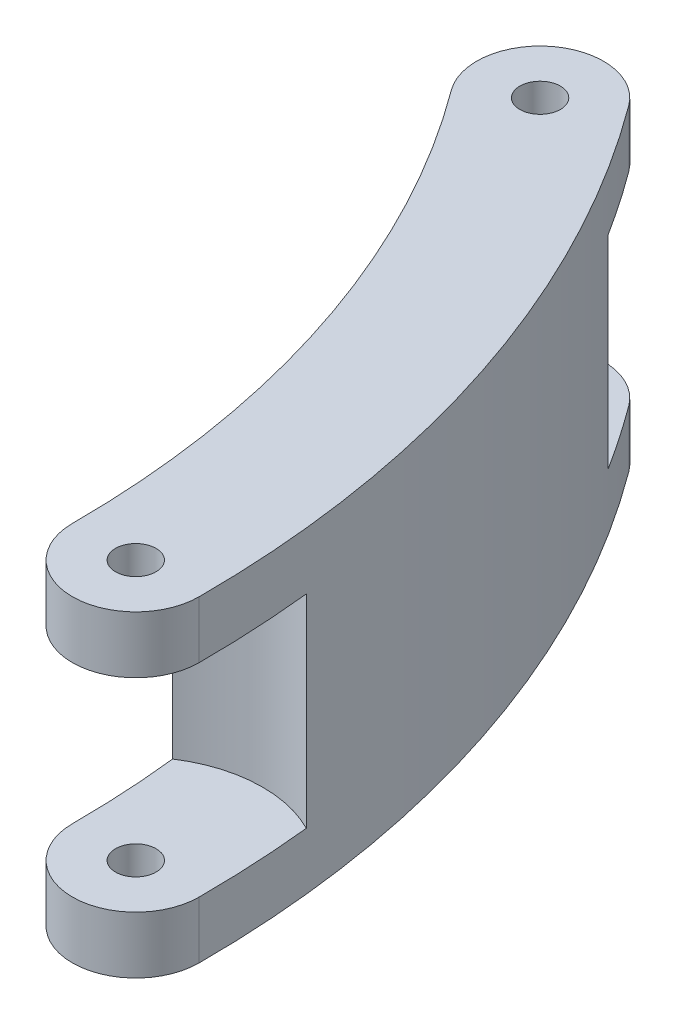
ISO-10303-21;
HEADER;
FILE_DESCRIPTION(('STEP AP214'),'2;1');
FILE_NAME('part.step','',(''),(''),'','','');
FILE_SCHEMA(('AUTOMOTIVE_DESIGN { 1 0 10303 214 1 1 1 1 }'));
ENDSEC;
DATA;
#1=APPLICATION_CONTEXT('core data for automotive mechanical design processes');
#2=APPLICATION_PROTOCOL_DEFINITION('international standard','automotive_design',2000,#1);
#3=PRODUCT_CONTEXT('',#1,'mechanical');
#4=PRODUCT('Part','Part','',(#3));
#5=PRODUCT_RELATED_PRODUCT_CATEGORY('part','',(#4));
#6=PRODUCT_DEFINITION_FORMATION('','',#4);
#7=PRODUCT_DEFINITION_CONTEXT('part definition',#1,'design');
#8=PRODUCT_DEFINITION('design','',#6,#7);
#9=PRODUCT_DEFINITION_SHAPE('','',#8);
#10=(LENGTH_UNIT() NAMED_UNIT(*) SI_UNIT(.MILLI.,.METRE.));
#11=(NAMED_UNIT(*) PLANE_ANGLE_UNIT() SI_UNIT($,.RADIAN.));
#12=(NAMED_UNIT(*) SI_UNIT($,.STERADIAN.) SOLID_ANGLE_UNIT());
#13=UNCERTAINTY_MEASURE_WITH_UNIT(LENGTH_MEASURE(1.E-05),#10,'distance_accuracy_value','');
#14=(GEOMETRIC_REPRESENTATION_CONTEXT(3) GLOBAL_UNCERTAINTY_ASSIGNED_CONTEXT((#13)) GLOBAL_UNIT_ASSIGNED_CONTEXT((#10,
#11,#12)) REPRESENTATION_CONTEXT('',''));
#15=CARTESIAN_POINT('',(0.,0.,0.));
#16=DIRECTION('',(0.,0.,1.));
#17=DIRECTION('',(1.,0.,0.));
#18=AXIS2_PLACEMENT_3D('',#15,#16,#17);
#19=CARTESIAN_POINT('',(64.375,12.5,-47.4958879799083));
#20=DIRECTION('',(0.,-1.,0.));
#21=DIRECTION('',(0.,0.,-1.));
#22=AXIS2_PLACEMENT_3D('',#19,#20,#21);
#23=CYLINDRICAL_SURFACE('',#22,5.00000000000002);
#24=CARTESIAN_POINT('',(64.375,-8.,-47.4958879799083));
#25=DIRECTION('',(0.,1.,0.));
#26=DIRECTION('',(0.,0.,1.));
#27=AXIS2_PLACEMENT_3D('',#24,#25,#26);
#28=CIRCLE('',#27,5.00000000000001);
#29=CARTESIAN_POINT('',(68.3984375,-8.,-50.4643809786526));
#30=VERTEX_POINT('',#29);
#31=CARTESIAN_POINT('',(60.3515625040183,-8.,-44.5273949757177));
#32=VERTEX_POINT('',#31);
#33=EDGE_CURVE('E146',#30,#32,#28,.T.);
#34=ORIENTED_EDGE('',*,*,#33,.F.);
#35=DIRECTION('',(0.,-1.,0.));
#36=VECTOR('',#35,1.);
#37=CARTESIAN_POINT('',(68.3984375,12.5,-50.4643809786526));
#38=LINE('',#37,#36);
#39=CARTESIAN_POINT('',(68.3984375,-12.5,-50.4643809786526));
#40=VERTEX_POINT('',#39);
#41=EDGE_CURVE('E160',#30,#40,#38,.T.);
#42=ORIENTED_EDGE('',*,*,#41,.T.);
#43=CARTESIAN_POINT('',(64.375,-12.5,-47.4958879799083));
#44=DIRECTION('',(0.,1.,0.));
#45=DIRECTION('',(0.,0.,1.));
#46=AXIS2_PLACEMENT_3D('',#43,#44,#45);
#47=CIRCLE('',#46,5.00000000000002);
#48=CARTESIAN_POINT('',(60.3515625040183,-12.5,-44.5273949757177));
#49=VERTEX_POINT('',#48);
#50=EDGE_CURVE('E290',#40,#49,#47,.T.);
#51=ORIENTED_EDGE('',*,*,#50,.T.);
#52=DIRECTION('',(0.,-1.,0.));
#53=VECTOR('',#52,1.);
#54=CARTESIAN_POINT('',(60.3515625040183,12.5,-44.5273949757177));
#55=LINE('',#54,#53);
#56=EDGE_CURVE('E162',#32,#49,#55,.T.);
#57=ORIENTED_EDGE('',*,*,#56,.F.);
#58=EDGE_LOOP('',(#34,#42,#51,#57));
#59=FACE_BOUND('',#58,.T.);
#60=ADVANCED_FACE('F45',(#59),#23,.T.);
#61=CARTESIAN_POINT('',(0.,12.5,0.));
#62=DIRECTION('',(0.,-1.,0.));
#63=DIRECTION('',(0.,0.,-1.));
#64=AXIS2_PLACEMENT_3D('',#61,#62,#63);
#65=CYLINDRICAL_SURFACE('',#64,75.);
#66=CARTESIAN_POINT('',(0.,-8.,0.));
#67=DIRECTION('',(0.,-1.,0.));
#68=DIRECTION('',(0.,0.,1.));
#69=AXIS2_PLACEMENT_3D('',#66,#67,#68);
#70=CIRCLE('',#69,75.);
#71=CARTESIAN_POINT('',(66.8084611687491,-8.,-34.0826864590183));
#72=VERTEX_POINT('',#71);
#73=EDGE_CURVE('E164',#32,#72,#70,.T.);
#74=ORIENTED_EDGE('',*,*,#73,.F.);
#75=ORIENTED_EDGE('',*,*,#56,.T.);
#76=CARTESIAN_POINT('',(0.,-12.5,0.));
#77=DIRECTION('',(0.,-1.,0.));
#78=DIRECTION('',(0.,0.,-1.));
#79=AXIS2_PLACEMENT_3D('',#76,#77,#78);
#80=CIRCLE('',#79,75.);
#81=CARTESIAN_POINT('',(75.,-12.5,0.));
#82=VERTEX_POINT('',#81);
#83=EDGE_CURVE('E302',#49,#82,#80,.T.);
#84=ORIENTED_EDGE('',*,*,#83,.T.);
#85=DIRECTION('',(0.,-1.,0.));
#86=VECTOR('',#85,1.);
#87=CARTESIAN_POINT('',(75.,12.5,0.));
#88=LINE('',#87,#86);
#89=CARTESIAN_POINT('',(75.,-8.,0.));
#90=VERTEX_POINT('',#89);
#91=EDGE_CURVE('E187',#90,#82,#88,.T.);
#92=ORIENTED_EDGE('',*,*,#91,.F.);
#93=CARTESIAN_POINT('',(0.,-8.,0.));
#94=DIRECTION('',(0.,1.,0.));
#95=DIRECTION('',(0.,0.,1.));
#96=AXIS2_PLACEMENT_3D('',#93,#94,#95);
#97=CIRCLE('',#96,75.);
#98=CARTESIAN_POINT('',(74.53125,-8.,-8.37214270288675));
#99=VERTEX_POINT('',#98);
#100=EDGE_CURVE('E283',#99,#90,#97,.F.);
#101=ORIENTED_EDGE('',*,*,#100,.F.);
#102=DIRECTION('',(0.,1.,0.));
#103=VECTOR('',#102,1.);
#104=CARTESIAN_POINT('',(74.53125,0.,-8.37214270288676));
#105=LINE('',#104,#103);
#106=CARTESIAN_POINT('',(74.53125,8.,-8.37214270288675));
#107=VERTEX_POINT('',#106);
#108=EDGE_CURVE('E286',#99,#107,#105,.T.);
#109=ORIENTED_EDGE('',*,*,#108,.T.);
#110=CARTESIAN_POINT('',(0.,8.,0.));
#111=DIRECTION('',(0.,1.,0.));
#112=DIRECTION('',(0.,0.,1.));
#113=AXIS2_PLACEMENT_3D('',#110,#111,#112);
#114=CIRCLE('',#113,75.);
#115=CARTESIAN_POINT('',(75.,8.,0.));
#116=VERTEX_POINT('',#115);
#117=EDGE_CURVE('E276',#107,#116,#114,.F.);
#118=ORIENTED_EDGE('',*,*,#117,.T.);
#119=CARTESIAN_POINT('',(75.,12.5,0.));
#120=VERTEX_POINT('',#119);
#121=EDGE_CURVE('E188',#120,#116,#88,.T.);
#122=ORIENTED_EDGE('',*,*,#121,.F.);
#123=CARTESIAN_POINT('',(0.,12.5,0.));
#124=DIRECTION('',(0.,-1.,0.));
#125=DIRECTION('',(0.,0.,-1.));
#126=AXIS2_PLACEMENT_3D('',#123,#124,#125);
#127=CIRCLE('',#126,75.);
#128=CARTESIAN_POINT('',(60.3515625040183,12.5,-44.5273949757177));
#129=VERTEX_POINT('',#128);
#130=EDGE_CURVE('E295',#129,#120,#127,.T.);
#131=ORIENTED_EDGE('',*,*,#130,.F.);
#132=CARTESIAN_POINT('',(60.3515625040183,8.,-44.5273949757177));
#133=VERTEX_POINT('',#132);
#134=EDGE_CURVE('E192',#129,#133,#55,.T.);
#135=ORIENTED_EDGE('',*,*,#134,.T.);
#136=CARTESIAN_POINT('',(0.,8.,0.));
#137=DIRECTION('',(0.,-1.,0.));
#138=DIRECTION('',(0.,0.,1.));
#139=AXIS2_PLACEMENT_3D('',#136,#137,#138);
#140=CIRCLE('',#139,75.);
#141=CARTESIAN_POINT('',(66.8084611687491,8.,-34.0826864590183));
#142=VERTEX_POINT('',#141);
#143=EDGE_CURVE('E248',#133,#142,#140,.T.);
#144=ORIENTED_EDGE('',*,*,#143,.T.);
#145=DIRECTION('',(0.,1.,0.));
#146=VECTOR('',#145,1.);
#147=CARTESIAN_POINT('',(66.8084611687491,-8.,-34.0826864590183));
#148=LINE('',#147,#146);
#149=EDGE_CURVE('E242',#72,#142,#148,.T.);
#150=ORIENTED_EDGE('',*,*,#149,.F.);
#151=EDGE_LOOP('',(#74,#75,#84,#92,#101,#109,#118,#122,#131,#135,#144,#150));
#152=FACE_BOUND('',#151,.T.);
#153=ADVANCED_FACE('F319',(#152),#65,.F.);
#154=CARTESIAN_POINT('',(80.,12.5,0.));
#155=DIRECTION('',(0.,-1.,0.));
#156=DIRECTION('',(0.,0.,-1.));
#157=AXIS2_PLACEMENT_3D('',#154,#155,#156);
#158=CYLINDRICAL_SURFACE('',#157,5.);
#159=CARTESIAN_POINT('',(80.,-8.,0.));
#160=DIRECTION('',(0.,1.,0.));
#161=DIRECTION('',(0.,0.,1.));
#162=AXIS2_PLACEMENT_3D('',#159,#160,#161);
#163=CIRCLE('',#162,5.);
#164=CARTESIAN_POINT('',(85.,-8.,0.));
#165=VERTEX_POINT('',#164);
#166=EDGE_CURVE('E280',#90,#165,#163,.T.);
#167=ORIENTED_EDGE('',*,*,#166,.F.);
#168=ORIENTED_EDGE('',*,*,#91,.T.);
#169=CARTESIAN_POINT('',(80.,-12.5,0.));
#170=DIRECTION('',(0.,1.,0.));
#171=DIRECTION('',(0.,0.,1.));
#172=AXIS2_PLACEMENT_3D('',#169,#170,#171);
#173=CIRCLE('',#172,5.);
#174=CARTESIAN_POINT('',(85.,-12.5,0.));
#175=VERTEX_POINT('',#174);
#176=EDGE_CURVE('E305',#82,#175,#173,.T.);
#177=ORIENTED_EDGE('',*,*,#176,.T.);
#178=DIRECTION('',(0.,-1.,0.));
#179=VECTOR('',#178,1.);
#180=CARTESIAN_POINT('',(85.,12.5,0.));
#181=LINE('',#180,#179);
#182=EDGE_CURVE('E177',#165,#175,#181,.T.);
#183=ORIENTED_EDGE('',*,*,#182,.F.);
#184=EDGE_LOOP('',(#167,#168,#177,#183));
#185=FACE_BOUND('',#184,.T.);
#186=ADVANCED_FACE('F313',(#185),#158,.T.);
#187=CARTESIAN_POINT('',(0.,12.5,0.));
#188=DIRECTION('',(0.,-1.,0.));
#189=DIRECTION('',(0.,0.,-1.));
#190=AXIS2_PLACEMENT_3D('',#187,#188,#189);
#191=CYLINDRICAL_SURFACE('',#190,85.);
#192=CARTESIAN_POINT('',(0.,-8.,0.));
#193=DIRECTION('',(0.,1.,0.));
#194=DIRECTION('',(0.,0.,1.));
#195=AXIS2_PLACEMENT_3D('',#192,#193,#194);
#196=CIRCLE('',#195,85.);
#197=CARTESIAN_POINT('',(71.9359855238672,-8.,-45.2792887169175));
#198=VERTEX_POINT('',#197);
#199=EDGE_CURVE('E142',#198,#30,#196,.T.);
#200=ORIENTED_EDGE('',*,*,#199,.F.);
#201=DIRECTION('',(0.,1.,0.));
#202=VECTOR('',#201,1.);
#203=CARTESIAN_POINT('',(71.9359855238672,-8.,-45.2792887169175));
#204=LINE('',#203,#202);
#205=CARTESIAN_POINT('',(71.9359855238672,8.,-45.2792887169175));
#206=VERTEX_POINT('',#205);
#207=EDGE_CURVE('E259',#198,#206,#204,.T.);
#208=ORIENTED_EDGE('',*,*,#207,.T.);
#209=CARTESIAN_POINT('',(0.,8.,0.));
#210=DIRECTION('',(0.,1.,0.));
#211=DIRECTION('',(0.,0.,1.));
#212=AXIS2_PLACEMENT_3D('',#209,#210,#211);
#213=CIRCLE('',#212,85.);
#214=CARTESIAN_POINT('',(68.3984375,8.,-50.4643809786526));
#215=VERTEX_POINT('',#214);
#216=EDGE_CURVE('E243',#206,#215,#213,.T.);
#217=ORIENTED_EDGE('',*,*,#216,.T.);
#218=CARTESIAN_POINT('',(68.3984375,12.5,-50.4643809786526));
#219=VERTEX_POINT('',#218);
#220=EDGE_CURVE('E171',#219,#215,#38,.T.);
#221=ORIENTED_EDGE('',*,*,#220,.F.);
#222=CARTESIAN_POINT('',(0.,12.5,0.));
#223=DIRECTION('',(0.,1.,0.));
#224=DIRECTION('',(0.,0.,-1.));
#225=AXIS2_PLACEMENT_3D('',#222,#223,#224);
#226=CIRCLE('',#225,85.);
#227=CARTESIAN_POINT('',(85.,12.5,0.));
#228=VERTEX_POINT('',#227);
#229=EDGE_CURVE('E172',#228,#219,#226,.T.);
#230=ORIENTED_EDGE('',*,*,#229,.F.);
#231=CARTESIAN_POINT('',(85.,8.,0.));
#232=VERTEX_POINT('',#231);
#233=EDGE_CURVE('E183',#228,#232,#181,.T.);
#234=ORIENTED_EDGE('',*,*,#233,.T.);
#235=CARTESIAN_POINT('',(0.,8.,0.));
#236=DIRECTION('',(0.,1.,0.));
#237=DIRECTION('',(0.,0.,1.));
#238=AXIS2_PLACEMENT_3D('',#235,#236,#237);
#239=CIRCLE('',#238,85.);
#240=CARTESIAN_POINT('',(84.53125,8.,-8.91446989099742));
#241=VERTEX_POINT('',#240);
#242=EDGE_CURVE('E196',#232,#241,#239,.T.);
#243=ORIENTED_EDGE('',*,*,#242,.T.);
#244=DIRECTION('',(0.,1.,0.));
#245=VECTOR('',#244,1.);
#246=CARTESIAN_POINT('',(84.5312500000001,0.,-8.9144698909974));
#247=LINE('',#246,#245);
#248=CARTESIAN_POINT('',(84.53125,-8.,-8.91446989099742));
#249=VERTEX_POINT('',#248);
#250=EDGE_CURVE('E55',#241,#249,#247,.F.);
#251=ORIENTED_EDGE('',*,*,#250,.T.);
#252=CARTESIAN_POINT('',(0.,-8.,0.));
#253=DIRECTION('',(0.,1.,0.));
#254=DIRECTION('',(0.,0.,1.));
#255=AXIS2_PLACEMENT_3D('',#252,#253,#254);
#256=CIRCLE('',#255,85.);
#257=EDGE_CURVE('E11',#165,#249,#256,.T.);
#258=ORIENTED_EDGE('',*,*,#257,.F.);
#259=ORIENTED_EDGE('',*,*,#182,.T.);
#260=CARTESIAN_POINT('',(0.,-12.5,0.));
#261=DIRECTION('',(0.,1.,0.));
#262=DIRECTION('',(0.,0.,-1.));
#263=AXIS2_PLACEMENT_3D('',#260,#261,#262);
#264=CIRCLE('',#263,85.);
#265=EDGE_CURVE('E168',#175,#40,#264,.T.);
#266=ORIENTED_EDGE('',*,*,#265,.T.);
#267=ORIENTED_EDGE('',*,*,#41,.F.);
#268=EDGE_LOOP('',(#200,#208,#217,#221,#230,#234,#243,#251,#258,#259,#266,#267));
#269=FACE_BOUND('',#268,.T.);
#270=ADVANCED_FACE('F166',(#269),#191,.T.);
#271=ORIENTED_EDGE('',*,*,#220,.T.);
#272=CARTESIAN_POINT('',(64.375,8.,-47.4958879799083));
#273=DIRECTION('',(0.,1.,0.));
#274=DIRECTION('',(0.,0.,1.));
#275=AXIS2_PLACEMENT_3D('',#272,#273,#274);
#276=CIRCLE('',#275,5.00000000000001);
#277=EDGE_CURVE('E71',#215,#133,#276,.T.);
#278=ORIENTED_EDGE('',*,*,#277,.T.);
#279=ORIENTED_EDGE('',*,*,#134,.F.);
#280=CARTESIAN_POINT('',(64.375,12.5,-47.4958879799083));
#281=DIRECTION('',(0.,1.,0.));
#282=DIRECTION('',(0.,0.,1.));
#283=AXIS2_PLACEMENT_3D('',#280,#281,#282);
#284=CIRCLE('',#283,5.00000000000002);
#285=EDGE_CURVE('E291',#219,#129,#284,.T.);
#286=ORIENTED_EDGE('',*,*,#285,.F.);
#287=EDGE_LOOP('',(#271,#278,#279,#286));
#288=FACE_BOUND('',#287,.T.);
#289=ADVANCED_FACE('F47',(#288),#23,.T.);
#290=ORIENTED_EDGE('',*,*,#121,.T.);
#291=CARTESIAN_POINT('',(80.,8.,0.));
#292=DIRECTION('',(0.,1.,0.));
#293=DIRECTION('',(0.,0.,1.));
#294=AXIS2_PLACEMENT_3D('',#291,#292,#293);
#295=CIRCLE('',#294,5.);
#296=EDGE_CURVE('E262',#116,#232,#295,.T.);
#297=ORIENTED_EDGE('',*,*,#296,.T.);
#298=ORIENTED_EDGE('',*,*,#233,.F.);
#299=CARTESIAN_POINT('',(80.,12.5,0.));
#300=DIRECTION('',(0.,1.,0.));
#301=DIRECTION('',(0.,0.,1.));
#302=AXIS2_PLACEMENT_3D('',#299,#300,#301);
#303=CIRCLE('',#302,5.);
#304=EDGE_CURVE('E178',#120,#228,#303,.T.);
#305=ORIENTED_EDGE('',*,*,#304,.F.);
#306=EDGE_LOOP('',(#290,#297,#298,#305));
#307=FACE_BOUND('',#306,.T.);
#308=ADVANCED_FACE('F334',(#307),#158,.T.);
#309=CARTESIAN_POINT('',(32.1875,12.5,-23.7479439899542));
#310=DIRECTION('',(0.,1.,0.));
#311=DIRECTION('',(0.,0.,1.));
#312=AXIS2_PLACEMENT_3D('',#309,#310,#311);
#313=PLANE('',#312);
#314=CARTESIAN_POINT('',(64.375,12.5,-47.4958879799083));
#315=DIRECTION('',(0.,1.,0.));
#316=DIRECTION('',(0.,0.,1.));
#317=AXIS2_PLACEMENT_3D('',#314,#315,#316);
#318=CIRCLE('',#317,1.60000000000001);
#319=CARTESIAN_POINT('',(64.375,12.5,-45.8958879799083));
#320=VERTEX_POINT('',#319);
#321=EDGE_CURVE('E212',#320,#320,#318,.T.);
#322=ORIENTED_EDGE('',*,*,#321,.F.);
#323=EDGE_LOOP('',(#322));
#324=FACE_BOUND('',#323,.T.);
#325=CARTESIAN_POINT('',(80.,12.5,0.));
#326=DIRECTION('',(0.,1.,0.));
#327=DIRECTION('',(0.,0.,1.));
#328=AXIS2_PLACEMENT_3D('',#325,#326,#327);
#329=CIRCLE('',#328,1.60000000000001);
#330=CARTESIAN_POINT('',(80.,12.5,1.60000000000001));
#331=VERTEX_POINT('',#330);
#332=EDGE_CURVE('E230',#331,#331,#329,.T.);
#333=ORIENTED_EDGE('',*,*,#332,.F.);
#334=EDGE_LOOP('',(#333));
#335=FACE_BOUND('',#334,.T.);
#336=ORIENTED_EDGE('',*,*,#285,.T.);
#337=ORIENTED_EDGE('',*,*,#130,.T.);
#338=ORIENTED_EDGE('',*,*,#304,.T.);
#339=ORIENTED_EDGE('',*,*,#229,.T.);
#340=EDGE_LOOP('',(#336,#337,#338,#339));
#341=FACE_BOUND('',#340,.T.);
#342=ADVANCED_FACE('F338',(#324,#335,#341),#313,.T.);
#343=CARTESIAN_POINT('',(32.1875,-12.5,-23.7479439899542));
#344=DIRECTION('',(0.,1.,0.));
#345=DIRECTION('',(0.,0.,1.));
#346=AXIS2_PLACEMENT_3D('',#343,#344,#345);
#347=PLANE('',#346);
#348=CARTESIAN_POINT('',(64.375,-12.5,-47.4958879799083));
#349=DIRECTION('',(0.,1.,0.));
#350=DIRECTION('',(0.,0.,1.));
#351=AXIS2_PLACEMENT_3D('',#348,#349,#350);
#352=CIRCLE('',#351,1.60000000000001);
#353=CARTESIAN_POINT('',(64.375,-12.5,-45.8958879799083));
#354=VERTEX_POINT('',#353);
#355=EDGE_CURVE('E206',#354,#354,#352,.T.);
#356=ORIENTED_EDGE('',*,*,#355,.T.);
#357=EDGE_LOOP('',(#356));
#358=FACE_BOUND('',#357,.T.);
#359=CARTESIAN_POINT('',(80.,-12.5,0.));
#360=DIRECTION('',(0.,1.,0.));
#361=DIRECTION('',(0.,0.,1.));
#362=AXIS2_PLACEMENT_3D('',#359,#360,#361);
#363=CIRCLE('',#362,1.60000000000001);
#364=CARTESIAN_POINT('',(80.,-12.5,1.60000000000001));
#365=VERTEX_POINT('',#364);
#366=EDGE_CURVE('E215',#365,#365,#363,.T.);
#367=ORIENTED_EDGE('',*,*,#366,.T.);
#368=EDGE_LOOP('',(#367));
#369=FACE_BOUND('',#368,.T.);
#370=ORIENTED_EDGE('',*,*,#50,.F.);
#371=ORIENTED_EDGE('',*,*,#265,.F.);
#372=ORIENTED_EDGE('',*,*,#176,.F.);
#373=ORIENTED_EDGE('',*,*,#83,.F.);
#374=EDGE_LOOP('',(#370,#371,#372,#373));
#375=FACE_BOUND('',#374,.T.);
#376=ADVANCED_FACE('F317',(#358,#369,#375),#347,.F.);
#377=CARTESIAN_POINT('',(80.,-8.,0.));
#378=DIRECTION('',(0.,1.,0.));
#379=DIRECTION('',(0.,0.,1.));
#380=AXIS2_PLACEMENT_3D('',#377,#378,#379);
#381=CYLINDRICAL_SURFACE('',#380,9.99999999999999);
#382=CARTESIAN_POINT('',(80.,-8.,0.));
#383=DIRECTION('',(0.,1.,0.));
#384=DIRECTION('',(0.,0.,1.));
#385=AXIS2_PLACEMENT_3D('',#382,#383,#384);
#386=CIRCLE('',#385,9.99999999999999);
#387=EDGE_CURVE('E233',#249,#99,#386,.T.);
#388=ORIENTED_EDGE('',*,*,#387,.F.);
#389=ORIENTED_EDGE('',*,*,#250,.F.);
#390=CARTESIAN_POINT('',(80.,8.,0.));
#391=DIRECTION('',(0.,1.,0.));
#392=DIRECTION('',(0.,0.,1.));
#393=AXIS2_PLACEMENT_3D('',#390,#391,#392);
#394=CIRCLE('',#393,9.99999999999999);
#395=EDGE_CURVE('E63',#241,#107,#394,.T.);
#396=ORIENTED_EDGE('',*,*,#395,.T.);
#397=ORIENTED_EDGE('',*,*,#108,.F.);
#398=EDGE_LOOP('',(#388,#389,#396,#397));
#399=FACE_BOUND('',#398,.T.);
#400=ADVANCED_FACE('F330',(#399),#381,.F.);
#401=CARTESIAN_POINT('',(80.,-8.,0.));
#402=DIRECTION('',(0.,1.,0.));
#403=DIRECTION('',(0.,0.,1.));
#404=AXIS2_PLACEMENT_3D('',#401,#402,#403);
#405=PLANE('',#404);
#406=CARTESIAN_POINT('',(80.,-8.,0.));
#407=DIRECTION('',(0.,1.,0.));
#408=DIRECTION('',(0.,0.,1.));
#409=AXIS2_PLACEMENT_3D('',#406,#407,#408);
#410=CIRCLE('',#409,1.60000000000001);
#411=CARTESIAN_POINT('',(80.,-8.,1.60000000000001));
#412=VERTEX_POINT('',#411);
#413=EDGE_CURVE('E226',#412,#412,#410,.T.);
#414=ORIENTED_EDGE('',*,*,#413,.F.);
#415=EDGE_LOOP('',(#414));
#416=FACE_BOUND('',#415,.T.);
#417=ORIENTED_EDGE('',*,*,#100,.T.);
#418=ORIENTED_EDGE('',*,*,#166,.T.);
#419=ORIENTED_EDGE('',*,*,#257,.T.);
#420=ORIENTED_EDGE('',*,*,#387,.T.);
#421=EDGE_LOOP('',(#417,#418,#419,#420));
#422=FACE_BOUND('',#421,.T.);
#423=ADVANCED_FACE('F328',(#416,#422),#405,.T.);
#424=CARTESIAN_POINT('',(80.,8.,0.));
#425=DIRECTION('',(0.,1.,0.));
#426=DIRECTION('',(0.,0.,1.));
#427=AXIS2_PLACEMENT_3D('',#424,#425,#426);
#428=PLANE('',#427);
#429=CARTESIAN_POINT('',(80.,8.,0.));
#430=DIRECTION('',(0.,1.,0.));
#431=DIRECTION('',(0.,0.,1.));
#432=AXIS2_PLACEMENT_3D('',#429,#430,#431);
#433=CIRCLE('',#432,1.60000000000001);
#434=CARTESIAN_POINT('',(80.,8.,1.60000000000001));
#435=VERTEX_POINT('',#434);
#436=EDGE_CURVE('E49',#435,#435,#433,.T.);
#437=ORIENTED_EDGE('',*,*,#436,.T.);
#438=EDGE_LOOP('',(#437));
#439=FACE_BOUND('',#438,.T.);
#440=ORIENTED_EDGE('',*,*,#395,.F.);
#441=ORIENTED_EDGE('',*,*,#242,.F.);
#442=ORIENTED_EDGE('',*,*,#296,.F.);
#443=ORIENTED_EDGE('',*,*,#117,.F.);
#444=EDGE_LOOP('',(#440,#441,#442,#443));
#445=FACE_BOUND('',#444,.T.);
#446=ADVANCED_FACE('F359',(#439,#445),#428,.F.);
#447=CARTESIAN_POINT('',(71.9359855238672,-8.,-45.2792887169175));
#448=DIRECTION('',(0.978448893513377,0.,-0.206489134780619));
#449=DIRECTION('',(-0.206489134780619,0.,-0.978448893513377));
#450=AXIS2_PLACEMENT_3D('',#447,#448,#449);
#451=PLANE('',#450);
#452=DIRECTION('',(-0.206489134780619,0.,-0.978448893513377));
#453=VECTOR('',#452,1.);
#454=CARTESIAN_POINT('',(71.9359855238672,8.,-45.2792887169175));
#455=LINE('',#454,#453);
#456=CARTESIAN_POINT('',(73.4205664643837,8.,-38.244601007452));
#457=VERTEX_POINT('',#456);
#458=EDGE_CURVE('E155',#457,#206,#455,.T.);
#459=ORIENTED_EDGE('',*,*,#458,.T.);
#460=ORIENTED_EDGE('',*,*,#207,.F.);
#461=DIRECTION('',(-0.206489134780619,0.,-0.978448893513377));
#462=VECTOR('',#461,1.);
#463=CARTESIAN_POINT('',(71.9359855238672,-8.,-45.2792887169175));
#464=LINE('',#463,#462);
#465=CARTESIAN_POINT('',(73.4205664643837,-8.,-38.244601007452));
#466=VERTEX_POINT('',#465);
#467=EDGE_CURVE('E150',#466,#198,#464,.T.);
#468=ORIENTED_EDGE('',*,*,#467,.F.);
#469=DIRECTION('',(0.,1.,0.));
#470=VECTOR('',#469,1.);
#471=CARTESIAN_POINT('',(73.4205664643837,-8.,-38.244601007452));
#472=LINE('',#471,#470);
#473=EDGE_CURVE('E263',#466,#457,#472,.T.);
#474=ORIENTED_EDGE('',*,*,#473,.T.);
#475=EDGE_LOOP('',(#459,#460,#468,#474));
#476=FACE_BOUND('',#475,.T.);
#477=ADVANCED_FACE('F347',(#476),#451,.F.);
#478=CARTESIAN_POINT('',(73.4205664643837,-8.,-38.244601007452));
#479=DIRECTION('',(0.532697514316675,0.,0.846305712045497));
#480=DIRECTION('',(0.846305712045497,0.,-0.532697514316675));
#481=AXIS2_PLACEMENT_3D('',#478,#479,#480);
#482=PLANE('',#481);
#483=DIRECTION('',(0.846305712045497,0.,-0.532697514316675));
#484=VECTOR('',#483,1.);
#485=CARTESIAN_POINT('',(73.4205664643837,8.,-38.244601007452));
#486=LINE('',#485,#484);
#487=EDGE_CURVE('E252',#142,#457,#486,.T.);
#488=ORIENTED_EDGE('',*,*,#487,.T.);
#489=ORIENTED_EDGE('',*,*,#473,.F.);
#490=DIRECTION('',(0.846305712045497,0.,-0.532697514316675));
#491=VECTOR('',#490,1.);
#492=CARTESIAN_POINT('',(73.4205664643837,-8.,-38.244601007452));
#493=LINE('',#492,#491);
#494=EDGE_CURVE('E237',#72,#466,#493,.T.);
#495=ORIENTED_EDGE('',*,*,#494,.F.);
#496=ORIENTED_EDGE('',*,*,#149,.T.);
#497=EDGE_LOOP('',(#488,#489,#495,#496));
#498=FACE_BOUND('',#497,.T.);
#499=ADVANCED_FACE('F349',(#498),#482,.F.);
#500=CARTESIAN_POINT('',(0.,-8.,0.));
#501=DIRECTION('',(0.,1.,0.));
#502=DIRECTION('',(0.,0.,1.));
#503=AXIS2_PLACEMENT_3D('',#500,#501,#502);
#504=PLANE('',#503);
#505=CARTESIAN_POINT('',(64.375,-8.,-47.4958879799083));
#506=DIRECTION('',(0.,1.,0.));
#507=DIRECTION('',(0.,0.,1.));
#508=AXIS2_PLACEMENT_3D('',#505,#506,#507);
#509=CIRCLE('',#508,1.60000000000001);
#510=CARTESIAN_POINT('',(64.375,-8.,-45.8958879799083));
#511=VERTEX_POINT('',#510);
#512=EDGE_CURVE('E205',#511,#511,#509,.T.);
#513=ORIENTED_EDGE('',*,*,#512,.F.);
#514=EDGE_LOOP('',(#513));
#515=FACE_BOUND('',#514,.T.);
#516=ORIENTED_EDGE('',*,*,#199,.T.);
#517=ORIENTED_EDGE('',*,*,#33,.T.);
#518=ORIENTED_EDGE('',*,*,#73,.T.);
#519=ORIENTED_EDGE('',*,*,#494,.T.);
#520=ORIENTED_EDGE('',*,*,#467,.T.);
#521=EDGE_LOOP('',(#516,#517,#518,#519,#520));
#522=FACE_BOUND('',#521,.T.);
#523=ADVANCED_FACE('F144',(#515,#522),#504,.T.);
#524=CARTESIAN_POINT('',(0.,8.,0.));
#525=DIRECTION('',(0.,1.,0.));
#526=DIRECTION('',(0.,0.,1.));
#527=AXIS2_PLACEMENT_3D('',#524,#525,#526);
#528=PLANE('',#527);
#529=CARTESIAN_POINT('',(64.375,8.,-47.4958879799083));
#530=DIRECTION('',(0.,1.,0.));
#531=DIRECTION('',(0.,0.,1.));
#532=AXIS2_PLACEMENT_3D('',#529,#530,#531);
#533=CIRCLE('',#532,1.60000000000001);
#534=CARTESIAN_POINT('',(64.375,8.,-45.8958879799083));
#535=VERTEX_POINT('',#534);
#536=EDGE_CURVE('E202',#535,#535,#533,.T.);
#537=ORIENTED_EDGE('',*,*,#536,.T.);
#538=EDGE_LOOP('',(#537));
#539=FACE_BOUND('',#538,.T.);
#540=ORIENTED_EDGE('',*,*,#216,.F.);
#541=ORIENTED_EDGE('',*,*,#458,.F.);
#542=ORIENTED_EDGE('',*,*,#487,.F.);
#543=ORIENTED_EDGE('',*,*,#143,.F.);
#544=ORIENTED_EDGE('',*,*,#277,.F.);
#545=EDGE_LOOP('',(#540,#541,#542,#543,#544));
#546=FACE_BOUND('',#545,.T.);
#547=ADVANCED_FACE('F344',(#539,#546),#528,.F.);
#548=CARTESIAN_POINT('',(64.375,-12.5,-47.4958879799083));
#549=DIRECTION('',(0.,1.,0.));
#550=DIRECTION('',(0.,0.,1.));
#551=AXIS2_PLACEMENT_3D('',#548,#549,#550);
#552=CYLINDRICAL_SURFACE('',#551,1.60000000000001);
#553=ORIENTED_EDGE('',*,*,#321,.T.);
#554=EDGE_LOOP('',(#553));
#555=FACE_BOUND('',#554,.T.);
#556=ORIENTED_EDGE('',*,*,#536,.F.);
#557=EDGE_LOOP('',(#556));
#558=FACE_BOUND('',#557,.T.);
#559=ADVANCED_FACE('F421',(#555,#558),#552,.F.);
#560=ORIENTED_EDGE('',*,*,#512,.T.);
#561=EDGE_LOOP('',(#560));
#562=FACE_BOUND('',#561,.T.);
#563=ORIENTED_EDGE('',*,*,#355,.F.);
#564=EDGE_LOOP('',(#563));
#565=FACE_BOUND('',#564,.T.);
#566=ADVANCED_FACE('F430',(#562,#565),#552,.F.);
#567=CARTESIAN_POINT('',(80.,-12.5,0.));
#568=DIRECTION('',(0.,1.,0.));
#569=DIRECTION('',(0.,0.,1.));
#570=AXIS2_PLACEMENT_3D('',#567,#568,#569);
#571=CYLINDRICAL_SURFACE('',#570,1.60000000000001);
#572=ORIENTED_EDGE('',*,*,#332,.T.);
#573=EDGE_LOOP('',(#572));
#574=FACE_BOUND('',#573,.T.);
#575=ORIENTED_EDGE('',*,*,#436,.F.);
#576=EDGE_LOOP('',(#575));
#577=FACE_BOUND('',#576,.T.);
#578=ADVANCED_FACE('F440',(#574,#577),#571,.F.);
#579=ORIENTED_EDGE('',*,*,#413,.T.);
#580=EDGE_LOOP('',(#579));
#581=FACE_BOUND('',#580,.T.);
#582=ORIENTED_EDGE('',*,*,#366,.F.);
#583=EDGE_LOOP('',(#582));
#584=FACE_BOUND('',#583,.T.);
#585=ADVANCED_FACE('F449',(#581,#584),#571,.F.);
#586=CLOSED_SHELL('',(#60,#153,#186,#270,#289,#308,#342,#376,#400,#423,#446,#477,#499,#523,#547,
#559,#566,#578,#585));
#587=MANIFOLD_SOLID_BREP('B2',#586);
#588=ADVANCED_BREP_SHAPE_REPRESENTATION('',(#18,#587),#14);
#589=SHAPE_DEFINITION_REPRESENTATION(#9,#588);
ENDSEC;
END-ISO-10303-21;
